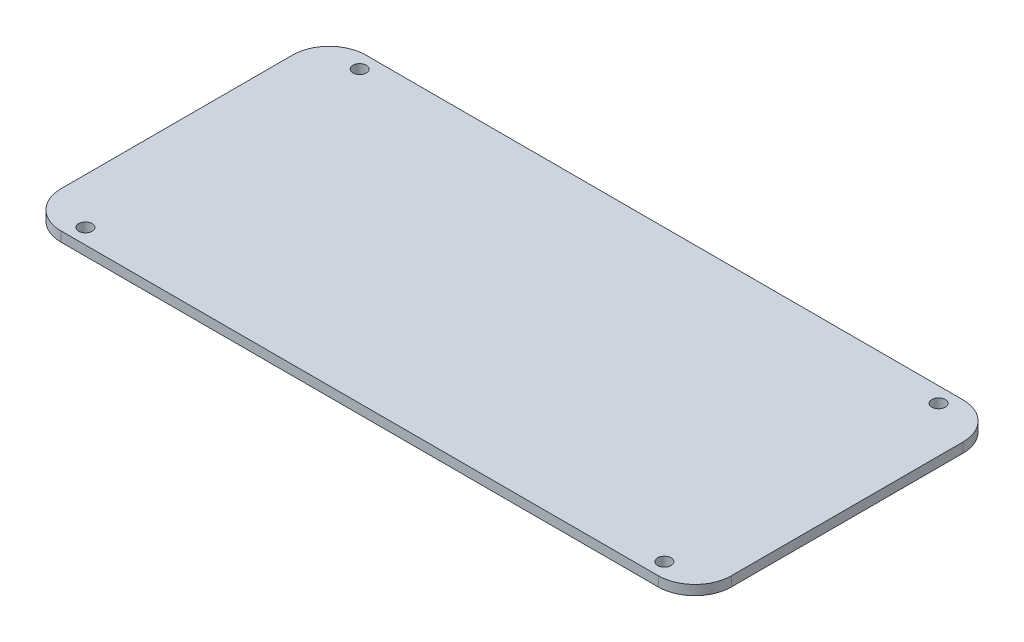
ISO-10303-21;
HEADER;
FILE_DESCRIPTION(('STEP AP214'),'2;1');
FILE_NAME('part.step','',(''),(''),'','','');
FILE_SCHEMA(('AUTOMOTIVE_DESIGN { 1 0 10303 214 1 1 1 1 }'));
ENDSEC;
DATA;
#1=APPLICATION_CONTEXT('core data for automotive mechanical design processes');
#2=APPLICATION_PROTOCOL_DEFINITION('international standard','automotive_design',2000,#1);
#3=PRODUCT_CONTEXT('',#1,'mechanical');
#4=PRODUCT('Part','Part','',(#3));
#5=PRODUCT_RELATED_PRODUCT_CATEGORY('part','',(#4));
#6=PRODUCT_DEFINITION_FORMATION('','',#4);
#7=PRODUCT_DEFINITION_CONTEXT('part definition',#1,'design');
#8=PRODUCT_DEFINITION('design','',#6,#7);
#9=PRODUCT_DEFINITION_SHAPE('','',#8);
#10=(LENGTH_UNIT() NAMED_UNIT(*) SI_UNIT(.MILLI.,.METRE.));
#11=(NAMED_UNIT(*) PLANE_ANGLE_UNIT() SI_UNIT($,.RADIAN.));
#12=(NAMED_UNIT(*) SI_UNIT($,.STERADIAN.) SOLID_ANGLE_UNIT());
#13=UNCERTAINTY_MEASURE_WITH_UNIT(LENGTH_MEASURE(1.E-05),#10,'distance_accuracy_value','');
#14=(GEOMETRIC_REPRESENTATION_CONTEXT(3) GLOBAL_UNCERTAINTY_ASSIGNED_CONTEXT((#13)) GLOBAL_UNIT_ASSIGNED_CONTEXT((#10,
#11,#12)) REPRESENTATION_CONTEXT('',''));
#15=CARTESIAN_POINT('',(0.,0.,0.));
#16=DIRECTION('',(0.,0.,1.));
#17=DIRECTION('',(1.,0.,0.));
#18=AXIS2_PLACEMENT_3D('',#15,#16,#17);
#19=CARTESIAN_POINT('',(49.,1.6,-19.));
#20=DIRECTION('',(0.,-1.,0.));
#21=DIRECTION('',(0.,0.,-1.));
#22=AXIS2_PLACEMENT_3D('',#19,#20,#21);
#23=PLANE('',#22);
#24=CARTESIAN_POINT('',(49.,1.6,-19.));
#25=DIRECTION('',(0.,1.,0.));
#26=DIRECTION('',(0.,0.,-1.));
#27=AXIS2_PLACEMENT_3D('',#24,#25,#26);
#28=CIRCLE('',#27,6.);
#29=CARTESIAN_POINT('',(55.,1.6,-19.));
#30=VERTEX_POINT('',#29);
#31=CARTESIAN_POINT('',(49.,1.6,-25.));
#32=VERTEX_POINT('',#31);
#33=EDGE_CURVE('E146',#30,#32,#28,.T.);
#34=ORIENTED_EDGE('',*,*,#33,.T.);
#35=DIRECTION('',(-1.,0.,0.));
#36=VECTOR('',#35,1.);
#37=CARTESIAN_POINT('',(-49.,1.6,-25.));
#38=LINE('',#37,#36);
#39=CARTESIAN_POINT('',(-49.,1.6,-25.));
#40=VERTEX_POINT('',#39);
#41=EDGE_CURVE('E94',#32,#40,#38,.T.);
#42=ORIENTED_EDGE('',*,*,#41,.T.);
#43=CARTESIAN_POINT('',(-49.,1.6,-19.));
#44=DIRECTION('',(0.,1.,0.));
#45=DIRECTION('',(0.,0.,1.));
#46=AXIS2_PLACEMENT_3D('',#43,#44,#45);
#47=CIRCLE('',#46,6.);
#48=CARTESIAN_POINT('',(-55.,1.6,-19.));
#49=VERTEX_POINT('',#48);
#50=EDGE_CURVE('E161',#40,#49,#47,.T.);
#51=ORIENTED_EDGE('',*,*,#50,.T.);
#52=DIRECTION('',(0.,0.,1.));
#53=VECTOR('',#52,1.);
#54=CARTESIAN_POINT('',(-55.,1.6,-19.));
#55=LINE('',#54,#53);
#56=CARTESIAN_POINT('',(-55.,1.6,19.));
#57=VERTEX_POINT('',#56);
#58=EDGE_CURVE('E174',#49,#57,#55,.T.);
#59=ORIENTED_EDGE('',*,*,#58,.T.);
#60=CARTESIAN_POINT('',(-49.,1.6,19.));
#61=DIRECTION('',(0.,1.,0.));
#62=DIRECTION('',(0.,0.,1.));
#63=AXIS2_PLACEMENT_3D('',#60,#61,#62);
#64=CIRCLE('',#63,6.);
#65=CARTESIAN_POINT('',(-49.,1.6,25.));
#66=VERTEX_POINT('',#65);
#67=EDGE_CURVE('E113',#57,#66,#64,.T.);
#68=ORIENTED_EDGE('',*,*,#67,.T.);
#69=DIRECTION('',(1.,0.,0.));
#70=VECTOR('',#69,1.);
#71=CARTESIAN_POINT('',(-48.9999999999999,1.6,25.));
#72=LINE('',#71,#70);
#73=CARTESIAN_POINT('',(49.,1.6,25.));
#74=VERTEX_POINT('',#73);
#75=EDGE_CURVE('E107',#66,#74,#72,.T.);
#76=ORIENTED_EDGE('',*,*,#75,.T.);
#77=CARTESIAN_POINT('',(49.,1.6,19.));
#78=DIRECTION('',(0.,1.,0.));
#79=DIRECTION('',(0.,0.,1.));
#80=AXIS2_PLACEMENT_3D('',#77,#78,#79);
#81=CIRCLE('',#80,6.);
#82=CARTESIAN_POINT('',(55.,1.6,19.));
#83=VERTEX_POINT('',#82);
#84=EDGE_CURVE('E111',#74,#83,#81,.T.);
#85=ORIENTED_EDGE('',*,*,#84,.T.);
#86=DIRECTION('',(0.,0.,-1.));
#87=VECTOR('',#86,1.);
#88=CARTESIAN_POINT('',(55.,1.6,-19.));
#89=LINE('',#88,#87);
#90=EDGE_CURVE('E51',#83,#30,#89,.T.);
#91=ORIENTED_EDGE('',*,*,#90,.T.);
#92=EDGE_LOOP('',(#34,#42,#51,#59,#68,#76,#85,#91));
#93=FACE_BOUND('',#92,.T.);
#94=CARTESIAN_POINT('',(47.5,1.6,-22.5));
#95=DIRECTION('',(0.,1.,0.));
#96=DIRECTION('',(0.,0.,1.));
#97=AXIS2_PLACEMENT_3D('',#94,#95,#96);
#98=CIRCLE('',#97,1.1);
#99=CARTESIAN_POINT('',(47.5,1.6,-21.4));
#100=VERTEX_POINT('',#99);
#101=EDGE_CURVE('E135',#100,#100,#98,.T.);
#102=ORIENTED_EDGE('',*,*,#101,.F.);
#103=EDGE_LOOP('',(#102));
#104=FACE_BOUND('',#103,.T.);
#105=CARTESIAN_POINT('',(47.5,1.6,22.5));
#106=DIRECTION('',(0.,1.,0.));
#107=DIRECTION('',(0.,0.,1.));
#108=AXIS2_PLACEMENT_3D('',#105,#106,#107);
#109=CIRCLE('',#108,1.1);
#110=CARTESIAN_POINT('',(47.5,1.6,23.6));
#111=VERTEX_POINT('',#110);
#112=EDGE_CURVE('E183',#111,#111,#109,.T.);
#113=ORIENTED_EDGE('',*,*,#112,.F.);
#114=EDGE_LOOP('',(#113));
#115=FACE_BOUND('',#114,.T.);
#116=CARTESIAN_POINT('',(-47.5,1.6,22.5));
#117=DIRECTION('',(0.,1.,0.));
#118=DIRECTION('',(0.,0.,1.));
#119=AXIS2_PLACEMENT_3D('',#116,#117,#118);
#120=CIRCLE('',#119,1.10000000000001);
#121=CARTESIAN_POINT('',(-47.5,1.6,23.6));
#122=VERTEX_POINT('',#121);
#123=EDGE_CURVE('E189',#122,#122,#120,.T.);
#124=ORIENTED_EDGE('',*,*,#123,.F.);
#125=EDGE_LOOP('',(#124));
#126=FACE_BOUND('',#125,.T.);
#127=CARTESIAN_POINT('',(-47.5,1.6,-22.5));
#128=DIRECTION('',(0.,1.,0.));
#129=DIRECTION('',(0.,0.,1.));
#130=AXIS2_PLACEMENT_3D('',#127,#128,#129);
#131=CIRCLE('',#130,1.1);
#132=CARTESIAN_POINT('',(-47.5,1.6,-21.4));
#133=VERTEX_POINT('',#132);
#134=EDGE_CURVE('E195',#133,#133,#131,.T.);
#135=ORIENTED_EDGE('',*,*,#134,.F.);
#136=EDGE_LOOP('',(#135));
#137=FACE_BOUND('',#136,.T.);
#138=ADVANCED_FACE('F34',(#93,#104,#115,#126,#137),#23,.F.);
#139=CARTESIAN_POINT('',(49.,0.,-19.));
#140=DIRECTION('',(0.,-1.,0.));
#141=DIRECTION('',(0.,0.,-1.));
#142=AXIS2_PLACEMENT_3D('',#139,#140,#141);
#143=PLANE('',#142);
#144=CARTESIAN_POINT('',(-47.5,0.,22.5));
#145=DIRECTION('',(0.,1.,0.));
#146=DIRECTION('',(0.,0.,1.));
#147=AXIS2_PLACEMENT_3D('',#144,#145,#146);
#148=CIRCLE('',#147,1.10000000000001);
#149=CARTESIAN_POINT('',(-47.5,0.,23.6));
#150=VERTEX_POINT('',#149);
#151=EDGE_CURVE('E192',#150,#150,#148,.T.);
#152=ORIENTED_EDGE('',*,*,#151,.T.);
#153=EDGE_LOOP('',(#152));
#154=FACE_BOUND('',#153,.T.);
#155=CARTESIAN_POINT('',(47.5,0.,-22.5));
#156=DIRECTION('',(0.,1.,0.));
#157=DIRECTION('',(0.,0.,1.));
#158=AXIS2_PLACEMENT_3D('',#155,#156,#157);
#159=CIRCLE('',#158,1.1);
#160=CARTESIAN_POINT('',(47.5,0.,-21.4));
#161=VERTEX_POINT('',#160);
#162=EDGE_CURVE('E180',#161,#161,#159,.T.);
#163=ORIENTED_EDGE('',*,*,#162,.T.);
#164=EDGE_LOOP('',(#163));
#165=FACE_BOUND('',#164,.T.);
#166=CARTESIAN_POINT('',(49.,0.,-19.));
#167=DIRECTION('',(0.,1.,0.));
#168=DIRECTION('',(0.,0.,-1.));
#169=AXIS2_PLACEMENT_3D('',#166,#167,#168);
#170=CIRCLE('',#169,6.);
#171=CARTESIAN_POINT('',(55.,0.,-19.));
#172=VERTEX_POINT('',#171);
#173=CARTESIAN_POINT('',(49.,0.,-25.));
#174=VERTEX_POINT('',#173);
#175=EDGE_CURVE('E131',#172,#174,#170,.T.);
#176=ORIENTED_EDGE('',*,*,#175,.F.);
#177=DIRECTION('',(0.,0.,-1.));
#178=VECTOR('',#177,1.);
#179=CARTESIAN_POINT('',(55.,0.,-19.));
#180=LINE('',#179,#178);
#181=CARTESIAN_POINT('',(55.,0.,19.));
#182=VERTEX_POINT('',#181);
#183=EDGE_CURVE('E86',#182,#172,#180,.T.);
#184=ORIENTED_EDGE('',*,*,#183,.F.);
#185=CARTESIAN_POINT('',(49.,0.,19.));
#186=DIRECTION('',(0.,1.,0.));
#187=DIRECTION('',(0.,0.,1.));
#188=AXIS2_PLACEMENT_3D('',#185,#186,#187);
#189=CIRCLE('',#188,6.);
#190=CARTESIAN_POINT('',(49.,0.,25.));
#191=VERTEX_POINT('',#190);
#192=EDGE_CURVE('E80',#191,#182,#189,.T.);
#193=ORIENTED_EDGE('',*,*,#192,.F.);
#194=DIRECTION('',(1.,0.,0.));
#195=VECTOR('',#194,1.);
#196=CARTESIAN_POINT('',(-48.9999999999999,0.,25.));
#197=LINE('',#196,#195);
#198=CARTESIAN_POINT('',(-49.,0.,25.));
#199=VERTEX_POINT('',#198);
#200=EDGE_CURVE('E121',#199,#191,#197,.T.);
#201=ORIENTED_EDGE('',*,*,#200,.F.);
#202=CARTESIAN_POINT('',(-49.,0.,19.));
#203=DIRECTION('',(0.,1.,0.));
#204=DIRECTION('',(0.,0.,1.));
#205=AXIS2_PLACEMENT_3D('',#202,#203,#204);
#206=CIRCLE('',#205,6.);
#207=CARTESIAN_POINT('',(-55.,0.,19.));
#208=VERTEX_POINT('',#207);
#209=EDGE_CURVE('E141',#208,#199,#206,.T.);
#210=ORIENTED_EDGE('',*,*,#209,.F.);
#211=DIRECTION('',(0.,0.,1.));
#212=VECTOR('',#211,1.);
#213=CARTESIAN_POINT('',(-55.,0.,-19.));
#214=LINE('',#213,#212);
#215=CARTESIAN_POINT('',(-55.,0.,-19.));
#216=VERTEX_POINT('',#215);
#217=EDGE_CURVE('E139',#216,#208,#214,.T.);
#218=ORIENTED_EDGE('',*,*,#217,.F.);
#219=CARTESIAN_POINT('',(-49.,0.,-19.));
#220=DIRECTION('',(0.,1.,0.));
#221=DIRECTION('',(0.,0.,1.));
#222=AXIS2_PLACEMENT_3D('',#219,#220,#221);
#223=CIRCLE('',#222,6.);
#224=CARTESIAN_POINT('',(-49.,0.,-25.));
#225=VERTEX_POINT('',#224);
#226=EDGE_CURVE('E137',#225,#216,#223,.T.);
#227=ORIENTED_EDGE('',*,*,#226,.F.);
#228=DIRECTION('',(-1.,0.,0.));
#229=VECTOR('',#228,1.);
#230=CARTESIAN_POINT('',(-49.,0.,-25.));
#231=LINE('',#230,#229);
#232=EDGE_CURVE('E134',#174,#225,#231,.T.);
#233=ORIENTED_EDGE('',*,*,#232,.F.);
#234=EDGE_LOOP('',(#176,#184,#193,#201,#210,#218,#227,#233));
#235=FACE_BOUND('',#234,.T.);
#236=CARTESIAN_POINT('',(47.5,0.,22.5));
#237=DIRECTION('',(0.,1.,0.));
#238=DIRECTION('',(0.,0.,1.));
#239=AXIS2_PLACEMENT_3D('',#236,#237,#238);
#240=CIRCLE('',#239,1.1);
#241=CARTESIAN_POINT('',(47.5,0.,23.6));
#242=VERTEX_POINT('',#241);
#243=EDGE_CURVE('E186',#242,#242,#240,.T.);
#244=ORIENTED_EDGE('',*,*,#243,.T.);
#245=EDGE_LOOP('',(#244));
#246=FACE_BOUND('',#245,.T.);
#247=CARTESIAN_POINT('',(-47.5,0.,-22.5));
#248=DIRECTION('',(0.,1.,0.));
#249=DIRECTION('',(0.,0.,1.));
#250=AXIS2_PLACEMENT_3D('',#247,#248,#249);
#251=CIRCLE('',#250,1.1);
#252=CARTESIAN_POINT('',(-47.5,0.,-21.4));
#253=VERTEX_POINT('',#252);
#254=EDGE_CURVE('E198',#253,#253,#251,.T.);
#255=ORIENTED_EDGE('',*,*,#254,.T.);
#256=EDGE_LOOP('',(#255));
#257=FACE_BOUND('',#256,.T.);
#258=ADVANCED_FACE('F165',(#154,#165,#235,#246,#257),#143,.T.);
#259=CARTESIAN_POINT('',(49.,1.6,-19.));
#260=DIRECTION('',(0.,-1.,0.));
#261=DIRECTION('',(0.,0.,-1.));
#262=AXIS2_PLACEMENT_3D('',#259,#260,#261);
#263=CYLINDRICAL_SURFACE('',#262,6.);
#264=ORIENTED_EDGE('',*,*,#175,.T.);
#265=DIRECTION('',(0.,-1.,0.));
#266=VECTOR('',#265,1.);
#267=CARTESIAN_POINT('',(49.,1.6,-25.));
#268=LINE('',#267,#266);
#269=EDGE_CURVE('E11',#32,#174,#268,.T.);
#270=ORIENTED_EDGE('',*,*,#269,.F.);
#271=ORIENTED_EDGE('',*,*,#33,.F.);
#272=DIRECTION('',(0.,-1.,0.));
#273=VECTOR('',#272,1.);
#274=CARTESIAN_POINT('',(55.,1.6,-19.));
#275=LINE('',#274,#273);
#276=EDGE_CURVE('E127',#30,#172,#275,.T.);
#277=ORIENTED_EDGE('',*,*,#276,.T.);
#278=EDGE_LOOP('',(#264,#270,#271,#277));
#279=FACE_BOUND('',#278,.T.);
#280=ADVANCED_FACE('F36',(#279),#263,.T.);
#281=CARTESIAN_POINT('',(-49.,1.6,-25.));
#282=DIRECTION('',(0.,0.,1.));
#283=DIRECTION('',(1.,0.,0.));
#284=AXIS2_PLACEMENT_3D('',#281,#282,#283);
#285=PLANE('',#284);
#286=ORIENTED_EDGE('',*,*,#232,.T.);
#287=DIRECTION('',(0.,-1.,0.));
#288=VECTOR('',#287,1.);
#289=CARTESIAN_POINT('',(-49.,1.6,-25.));
#290=LINE('',#289,#288);
#291=EDGE_CURVE('E43',#40,#225,#290,.T.);
#292=ORIENTED_EDGE('',*,*,#291,.F.);
#293=ORIENTED_EDGE('',*,*,#41,.F.);
#294=ORIENTED_EDGE('',*,*,#269,.T.);
#295=EDGE_LOOP('',(#286,#292,#293,#294));
#296=FACE_BOUND('',#295,.T.);
#297=ADVANCED_FACE('F230',(#296),#285,.F.);
#298=CARTESIAN_POINT('',(-49.,1.6,-19.));
#299=DIRECTION('',(0.,-1.,0.));
#300=DIRECTION('',(0.,0.,-1.));
#301=AXIS2_PLACEMENT_3D('',#298,#299,#300);
#302=CYLINDRICAL_SURFACE('',#301,6.);
#303=ORIENTED_EDGE('',*,*,#226,.T.);
#304=DIRECTION('',(0.,-1.,0.));
#305=VECTOR('',#304,1.);
#306=CARTESIAN_POINT('',(-55.,1.6,-19.));
#307=LINE('',#306,#305);
#308=EDGE_CURVE('E153',#49,#216,#307,.T.);
#309=ORIENTED_EDGE('',*,*,#308,.F.);
#310=ORIENTED_EDGE('',*,*,#50,.F.);
#311=ORIENTED_EDGE('',*,*,#291,.T.);
#312=EDGE_LOOP('',(#303,#309,#310,#311));
#313=FACE_BOUND('',#312,.T.);
#314=ADVANCED_FACE('F159',(#313),#302,.T.);
#315=CARTESIAN_POINT('',(-55.,1.6,-19.));
#316=DIRECTION('',(1.,0.,0.));
#317=DIRECTION('',(0.,0.,-1.));
#318=AXIS2_PLACEMENT_3D('',#315,#316,#317);
#319=PLANE('',#318);
#320=ORIENTED_EDGE('',*,*,#217,.T.);
#321=DIRECTION('',(0.,-1.,0.));
#322=VECTOR('',#321,1.);
#323=CARTESIAN_POINT('',(-55.,1.6,19.));
#324=LINE('',#323,#322);
#325=EDGE_CURVE('E150',#57,#208,#324,.T.);
#326=ORIENTED_EDGE('',*,*,#325,.F.);
#327=ORIENTED_EDGE('',*,*,#58,.F.);
#328=ORIENTED_EDGE('',*,*,#308,.T.);
#329=EDGE_LOOP('',(#320,#326,#327,#328));
#330=FACE_BOUND('',#329,.T.);
#331=ADVANCED_FACE('F170',(#330),#319,.F.);
#332=CARTESIAN_POINT('',(-49.,1.6,19.));
#333=DIRECTION('',(0.,-1.,0.));
#334=DIRECTION('',(0.,0.,-1.));
#335=AXIS2_PLACEMENT_3D('',#332,#333,#334);
#336=CYLINDRICAL_SURFACE('',#335,6.);
#337=ORIENTED_EDGE('',*,*,#209,.T.);
#338=DIRECTION('',(0.,-1.,0.));
#339=VECTOR('',#338,1.);
#340=CARTESIAN_POINT('',(-49.,1.6,25.));
#341=LINE('',#340,#339);
#342=EDGE_CURVE('E122',#66,#199,#341,.T.);
#343=ORIENTED_EDGE('',*,*,#342,.F.);
#344=ORIENTED_EDGE('',*,*,#67,.F.);
#345=ORIENTED_EDGE('',*,*,#325,.T.);
#346=EDGE_LOOP('',(#337,#343,#344,#345));
#347=FACE_BOUND('',#346,.T.);
#348=ADVANCED_FACE('F173',(#347),#336,.T.);
#349=CARTESIAN_POINT('',(-48.9999999999999,1.6,25.));
#350=DIRECTION('',(0.,0.,-1.));
#351=DIRECTION('',(-1.,0.,0.));
#352=AXIS2_PLACEMENT_3D('',#349,#350,#351);
#353=PLANE('',#352);
#354=ORIENTED_EDGE('',*,*,#200,.T.);
#355=DIRECTION('',(0.,-1.,0.));
#356=VECTOR('',#355,1.);
#357=CARTESIAN_POINT('',(49.,1.6,25.));
#358=LINE('',#357,#356);
#359=EDGE_CURVE('E118',#74,#191,#358,.T.);
#360=ORIENTED_EDGE('',*,*,#359,.F.);
#361=ORIENTED_EDGE('',*,*,#75,.F.);
#362=ORIENTED_EDGE('',*,*,#342,.T.);
#363=EDGE_LOOP('',(#354,#360,#361,#362));
#364=FACE_BOUND('',#363,.T.);
#365=ADVANCED_FACE('F119',(#364),#353,.F.);
#366=CARTESIAN_POINT('',(49.,1.6,19.));
#367=DIRECTION('',(0.,-1.,0.));
#368=DIRECTION('',(0.,0.,-1.));
#369=AXIS2_PLACEMENT_3D('',#366,#367,#368);
#370=CYLINDRICAL_SURFACE('',#369,6.);
#371=ORIENTED_EDGE('',*,*,#192,.T.);
#372=DIRECTION('',(0.,-1.,0.));
#373=VECTOR('',#372,1.);
#374=CARTESIAN_POINT('',(55.,1.6,19.));
#375=LINE('',#374,#373);
#376=EDGE_CURVE('E123',#83,#182,#375,.T.);
#377=ORIENTED_EDGE('',*,*,#376,.F.);
#378=ORIENTED_EDGE('',*,*,#84,.F.);
#379=ORIENTED_EDGE('',*,*,#359,.T.);
#380=EDGE_LOOP('',(#371,#377,#378,#379));
#381=FACE_BOUND('',#380,.T.);
#382=ADVANCED_FACE('F125',(#381),#370,.T.);
#383=CARTESIAN_POINT('',(55.,1.6,-19.));
#384=DIRECTION('',(-1.,0.,0.));
#385=DIRECTION('',(0.,0.,1.));
#386=AXIS2_PLACEMENT_3D('',#383,#384,#385);
#387=PLANE('',#386);
#388=ORIENTED_EDGE('',*,*,#183,.T.);
#389=ORIENTED_EDGE('',*,*,#276,.F.);
#390=ORIENTED_EDGE('',*,*,#90,.F.);
#391=ORIENTED_EDGE('',*,*,#376,.T.);
#392=EDGE_LOOP('',(#388,#389,#390,#391));
#393=FACE_BOUND('',#392,.T.);
#394=ADVANCED_FACE('F218',(#393),#387,.F.);
#395=CARTESIAN_POINT('',(47.5,1.6,-22.5));
#396=DIRECTION('',(0.,-1.,0.));
#397=DIRECTION('',(0.,0.,-1.));
#398=AXIS2_PLACEMENT_3D('',#395,#396,#397);
#399=CYLINDRICAL_SURFACE('',#398,1.1);
#400=ORIENTED_EDGE('',*,*,#101,.T.);
#401=EDGE_LOOP('',(#400));
#402=FACE_BOUND('',#401,.T.);
#403=ORIENTED_EDGE('',*,*,#162,.F.);
#404=EDGE_LOOP('',(#403));
#405=FACE_BOUND('',#404,.T.);
#406=ADVANCED_FACE('F215',(#402,#405),#399,.F.);
#407=CARTESIAN_POINT('',(47.5,1.6,22.5));
#408=DIRECTION('',(0.,-1.,0.));
#409=DIRECTION('',(0.,0.,-1.));
#410=AXIS2_PLACEMENT_3D('',#407,#408,#409);
#411=CYLINDRICAL_SURFACE('',#410,1.1);
#412=ORIENTED_EDGE('',*,*,#112,.T.);
#413=EDGE_LOOP('',(#412));
#414=FACE_BOUND('',#413,.T.);
#415=ORIENTED_EDGE('',*,*,#243,.F.);
#416=EDGE_LOOP('',(#415));
#417=FACE_BOUND('',#416,.T.);
#418=ADVANCED_FACE('F294',(#414,#417),#411,.F.);
#419=CARTESIAN_POINT('',(-47.5,1.6,22.5));
#420=DIRECTION('',(0.,-1.,0.));
#421=DIRECTION('',(0.,0.,-1.));
#422=AXIS2_PLACEMENT_3D('',#419,#420,#421);
#423=CYLINDRICAL_SURFACE('',#422,1.10000000000001);
#424=ORIENTED_EDGE('',*,*,#123,.T.);
#425=EDGE_LOOP('',(#424));
#426=FACE_BOUND('',#425,.T.);
#427=ORIENTED_EDGE('',*,*,#151,.F.);
#428=EDGE_LOOP('',(#427));
#429=FACE_BOUND('',#428,.T.);
#430=ADVANCED_FACE('F302',(#426,#429),#423,.F.);
#431=CARTESIAN_POINT('',(-47.5,1.6,-22.5));
#432=DIRECTION('',(0.,-1.,0.));
#433=DIRECTION('',(0.,0.,-1.));
#434=AXIS2_PLACEMENT_3D('',#431,#432,#433);
#435=CYLINDRICAL_SURFACE('',#434,1.1);
#436=ORIENTED_EDGE('',*,*,#134,.T.);
#437=EDGE_LOOP('',(#436));
#438=FACE_BOUND('',#437,.T.);
#439=ORIENTED_EDGE('',*,*,#254,.F.);
#440=EDGE_LOOP('',(#439));
#441=FACE_BOUND('',#440,.T.);
#442=ADVANCED_FACE('F204',(#438,#441),#435,.F.);
#443=CLOSED_SHELL('',(#138,#258,#280,#297,#314,#331,#348,#365,#382,#394,#406,#418,#430,#442));
#444=MANIFOLD_SOLID_BREP('B2',#443);
#445=ADVANCED_BREP_SHAPE_REPRESENTATION('',(#18,#444),#14);
#446=SHAPE_DEFINITION_REPRESENTATION(#9,#445);
ENDSEC;
END-ISO-10303-21;
